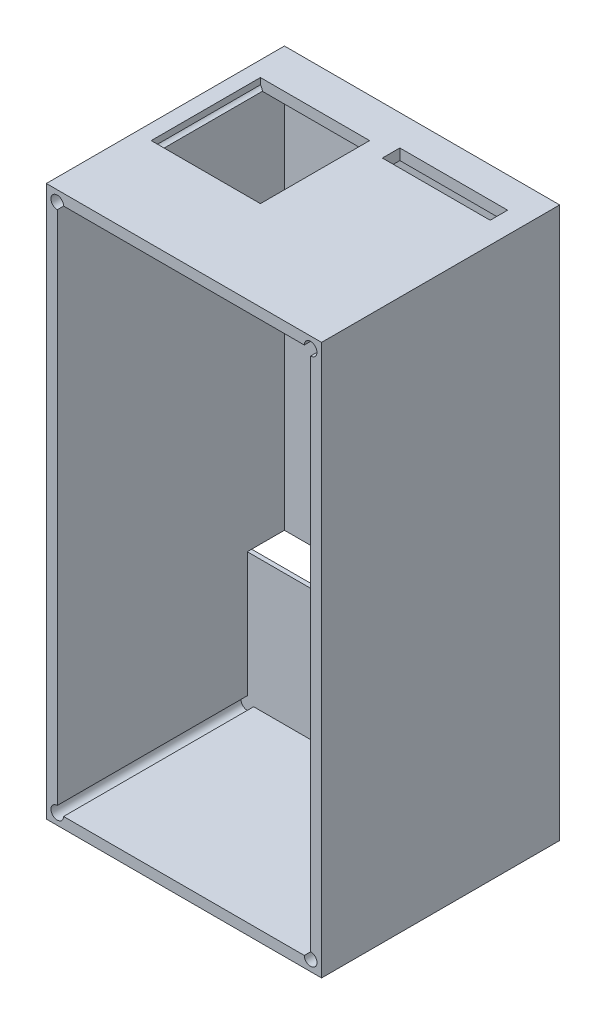
ISO-10303-21;
HEADER;
FILE_DESCRIPTION(('STEP AP214'),'2;1');
FILE_NAME('part.step','',(''),(''),'','','');
FILE_SCHEMA(('AUTOMOTIVE_DESIGN { 1 0 10303 214 1 1 1 1 }'));
ENDSEC;
DATA;
#1=APPLICATION_CONTEXT('core data for automotive mechanical design processes');
#2=APPLICATION_PROTOCOL_DEFINITION('international standard','automotive_design',2000,#1);
#3=PRODUCT_CONTEXT('',#1,'mechanical');
#4=PRODUCT('Part','Part','',(#3));
#5=PRODUCT_RELATED_PRODUCT_CATEGORY('part','',(#4));
#6=PRODUCT_DEFINITION_FORMATION('','',#4);
#7=PRODUCT_DEFINITION_CONTEXT('part definition',#1,'design');
#8=PRODUCT_DEFINITION('design','',#6,#7);
#9=PRODUCT_DEFINITION_SHAPE('','',#8);
#10=(LENGTH_UNIT() NAMED_UNIT(*) SI_UNIT(.MILLI.,.METRE.));
#11=(NAMED_UNIT(*) PLANE_ANGLE_UNIT() SI_UNIT($,.RADIAN.));
#12=(NAMED_UNIT(*) SI_UNIT($,.STERADIAN.) SOLID_ANGLE_UNIT());
#13=UNCERTAINTY_MEASURE_WITH_UNIT(LENGTH_MEASURE(1.E-05),#10,'distance_accuracy_value','');
#14=(GEOMETRIC_REPRESENTATION_CONTEXT(3) GLOBAL_UNCERTAINTY_ASSIGNED_CONTEXT((#13)) GLOBAL_UNIT_ASSIGNED_CONTEXT((#10,
#11,#12)) REPRESENTATION_CONTEXT('',''));
#15=CARTESIAN_POINT('',(0.,0.,0.));
#16=DIRECTION('',(0.,0.,1.));
#17=DIRECTION('',(1.,0.,0.));
#18=AXIS2_PLACEMENT_3D('',#15,#16,#17);
#19=CARTESIAN_POINT('',(0.,63.,52.));
#20=DIRECTION('',(0.,-1.,0.));
#21=DIRECTION('',(0.,0.,-1.));
#22=AXIS2_PLACEMENT_3D('',#19,#20,#21);
#23=PLANE('',#22);
#24=DIRECTION('',(0.,0.,-1.));
#25=VECTOR('',#24,1.);
#26=CARTESIAN_POINT('',(26.5858037953841,63.,0.));
#27=LINE('',#26,#25);
#28=CARTESIAN_POINT('',(26.5858037953841,63.,8.5));
#29=VERTEX_POINT('',#28);
#30=CARTESIAN_POINT('',(26.5858037953841,63.,4.5));
#31=VERTEX_POINT('',#30);
#32=EDGE_CURVE('E263',#29,#31,#27,.T.);
#33=ORIENTED_EDGE('',*,*,#32,.F.);
#34=DIRECTION('',(1.,0.,0.));
#35=VECTOR('',#34,1.);
#36=CARTESIAN_POINT('',(0.,63.,8.5));
#37=LINE('',#36,#35);
#38=CARTESIAN_POINT('',(1.91419620461589,63.,8.5));
#39=VERTEX_POINT('',#38);
#40=EDGE_CURVE('E57',#39,#29,#37,.T.);
#41=ORIENTED_EDGE('',*,*,#40,.F.);
#42=DIRECTION('',(0.,0.,-1.));
#43=VECTOR('',#42,1.);
#44=CARTESIAN_POINT('',(1.91419620461589,63.,0.));
#45=LINE('',#44,#43);
#46=CARTESIAN_POINT('',(1.91419620461589,63.,4.5));
#47=VERTEX_POINT('',#46);
#48=EDGE_CURVE('E270',#39,#47,#45,.T.);
#49=ORIENTED_EDGE('',*,*,#48,.T.);
#50=DIRECTION('',(1.,0.,0.));
#51=VECTOR('',#50,1.);
#52=CARTESIAN_POINT('',(0.,63.,4.5));
#53=LINE('',#52,#51);
#54=EDGE_CURVE('E253',#47,#31,#53,.T.);
#55=ORIENTED_EDGE('',*,*,#54,.T.);
#56=EDGE_LOOP('',(#33,#41,#49,#55));
#57=FACE_BOUND('',#56,.T.);
#58=DIRECTION('',(0.,0.,-1.));
#59=VECTOR('',#58,1.);
#60=CARTESIAN_POINT('',(31.5,63.,52.));
#61=LINE('',#60,#59);
#62=CARTESIAN_POINT('',(31.5,63.,52.));
#63=VERTEX_POINT('',#62);
#64=CARTESIAN_POINT('',(31.5,63.,-2.5));
#65=VERTEX_POINT('',#64);
#66=EDGE_CURVE('E534',#63,#65,#61,.T.);
#67=ORIENTED_EDGE('',*,*,#66,.T.);
#68=DIRECTION('',(1.,0.,0.));
#69=VECTOR('',#68,1.);
#70=CARTESIAN_POINT('',(31.5,63.,-2.5));
#71=LINE('',#70,#69);
#72=CARTESIAN_POINT('',(-31.5,63.,-2.5));
#73=VERTEX_POINT('',#72);
#74=EDGE_CURVE('E447',#73,#65,#71,.T.);
#75=ORIENTED_EDGE('',*,*,#74,.F.);
#76=DIRECTION('',(0.,0.,-1.));
#77=VECTOR('',#76,1.);
#78=CARTESIAN_POINT('',(-31.5,63.,52.));
#79=LINE('',#78,#77);
#80=CARTESIAN_POINT('',(-31.5,63.,52.));
#81=VERTEX_POINT('',#80);
#82=EDGE_CURVE('E530',#81,#73,#79,.T.);
#83=ORIENTED_EDGE('',*,*,#82,.F.);
#84=DIRECTION('',(-1.,0.,0.));
#85=VECTOR('',#84,1.);
#86=CARTESIAN_POINT('',(0.,63.,52.));
#87=LINE('',#86,#85);
#88=EDGE_CURVE('E487',#63,#81,#87,.T.);
#89=ORIENTED_EDGE('',*,*,#88,.F.);
#90=EDGE_LOOP('',(#67,#75,#83,#89));
#91=FACE_BOUND('',#90,.T.);
#92=DIRECTION('',(0.,0.,1.));
#93=VECTOR('',#92,1.);
#94=CARTESIAN_POINT('',(-3.00000000000001,63.,0.));
#95=LINE('',#94,#93);
#96=CARTESIAN_POINT('',(-3.00000000000001,63.,6.5));
#97=VERTEX_POINT('',#96);
#98=CARTESIAN_POINT('',(-3.,63.,31.5));
#99=VERTEX_POINT('',#98);
#100=EDGE_CURVE('E280',#97,#99,#95,.T.);
#101=ORIENTED_EDGE('',*,*,#100,.T.);
#102=DIRECTION('',(1.,0.,0.));
#103=VECTOR('',#102,1.);
#104=CARTESIAN_POINT('',(0.,63.,31.5));
#105=LINE('',#104,#103);
#106=CARTESIAN_POINT('',(-28.,63.,31.5));
#107=VERTEX_POINT('',#106);
#108=EDGE_CURVE('E296',#107,#99,#105,.T.);
#109=ORIENTED_EDGE('',*,*,#108,.F.);
#110=DIRECTION('',(0.,0.,1.));
#111=VECTOR('',#110,1.);
#112=CARTESIAN_POINT('',(-28.,63.,0.));
#113=LINE('',#112,#111);
#114=CARTESIAN_POINT('',(-28.,63.,6.5));
#115=VERTEX_POINT('',#114);
#116=EDGE_CURVE('E292',#115,#107,#113,.T.);
#117=ORIENTED_EDGE('',*,*,#116,.F.);
#118=DIRECTION('',(1.,0.,0.));
#119=VECTOR('',#118,1.);
#120=CARTESIAN_POINT('',(0.,63.,6.5));
#121=LINE('',#120,#119);
#122=EDGE_CURVE('E288',#115,#97,#121,.T.);
#123=ORIENTED_EDGE('',*,*,#122,.T.);
#124=EDGE_LOOP('',(#101,#109,#117,#123));
#125=FACE_BOUND('',#124,.T.);
#126=ADVANCED_FACE('F41',(#57,#91,#125),#23,.F.);
#127=CARTESIAN_POINT('',(0.,0.,7.5));
#128=DIRECTION('',(0.,0.,-1.));
#129=DIRECTION('',(-1.,0.,0.));
#130=AXIS2_PLACEMENT_3D('',#127,#128,#129);
#131=PLANE('',#130);
#132=DIRECTION('',(1.,0.,0.));
#133=VECTOR('',#132,1.);
#134=CARTESIAN_POINT('',(-31.5,-30.5,7.5));
#135=LINE('',#134,#133);
#136=CARTESIAN_POINT('',(-29.,-30.5,7.5));
#137=VERTEX_POINT('',#136);
#138=CARTESIAN_POINT('',(-10.,-30.5,7.5));
#139=VERTEX_POINT('',#138);
#140=EDGE_CURVE('E379',#137,#139,#135,.T.);
#141=ORIENTED_EDGE('',*,*,#140,.T.);
#142=DIRECTION('',(0.,1.,0.));
#143=VECTOR('',#142,1.);
#144=CARTESIAN_POINT('',(-10.,-63.,7.5));
#145=LINE('',#144,#143);
#146=CARTESIAN_POINT('',(-10.,-63.,7.5));
#147=VERTEX_POINT('',#146);
#148=EDGE_CURVE('E371',#147,#139,#145,.T.);
#149=ORIENTED_EDGE('',*,*,#148,.F.);
#150=DIRECTION('',(-1.,0.,0.));
#151=VECTOR('',#150,1.);
#152=CARTESIAN_POINT('',(-31.5,-63.,7.5));
#153=LINE('',#152,#151);
#154=CARTESIAN_POINT('',(-31.5,-63.,7.5));
#155=VERTEX_POINT('',#154);
#156=EDGE_CURVE('E414',#147,#155,#153,.T.);
#157=ORIENTED_EDGE('',*,*,#156,.T.);
#158=DIRECTION('',(0.,1.,0.));
#159=VECTOR('',#158,1.);
#160=CARTESIAN_POINT('',(-31.5,-63.,7.5));
#161=LINE('',#160,#159);
#162=CARTESIAN_POINT('',(-31.5,-30.5,7.5));
#163=VERTEX_POINT('',#162);
#164=EDGE_CURVE('E407',#155,#163,#161,.T.);
#165=ORIENTED_EDGE('',*,*,#164,.T.);
#166=DIRECTION('',(1.,0.,0.));
#167=VECTOR('',#166,1.);
#168=CARTESIAN_POINT('',(-31.5,-30.5,7.5));
#169=LINE('',#168,#167);
#170=EDGE_CURVE('E411',#163,#137,#169,.T.);
#171=ORIENTED_EDGE('',*,*,#170,.T.);
#172=EDGE_LOOP('',(#141,#149,#157,#165,#171));
#173=FACE_BOUND('',#172,.T.);
#174=ADVANCED_FACE('F614',(#173),#131,.T.);
#175=CARTESIAN_POINT('',(-31.5,-30.5,7.5));
#176=DIRECTION('',(0.,1.,0.));
#177=DIRECTION('',(-1.,0.,0.));
#178=AXIS2_PLACEMENT_3D('',#175,#176,#177);
#179=PLANE('',#178);
#180=DIRECTION('',(0.,0.,-1.));
#181=VECTOR('',#180,1.);
#182=CARTESIAN_POINT('',(-10.,-30.5,7.5));
#183=LINE('',#182,#181);
#184=CARTESIAN_POINT('',(-10.,-30.5,0.));
#185=VERTEX_POINT('',#184);
#186=CARTESIAN_POINT('',(-10.,-30.5,-2.5));
#187=VERTEX_POINT('',#186);
#188=EDGE_CURVE('E537',#185,#187,#183,.T.);
#189=ORIENTED_EDGE('',*,*,#188,.F.);
#190=DIRECTION('',(1.,0.,0.));
#191=VECTOR('',#190,1.);
#192=CARTESIAN_POINT('',(0.,-30.5,0.));
#193=LINE('',#192,#191);
#194=CARTESIAN_POINT('',(-29.,-30.5,0.));
#195=VERTEX_POINT('',#194);
#196=EDGE_CURVE('E423',#195,#185,#193,.T.);
#197=ORIENTED_EDGE('',*,*,#196,.F.);
#198=DIRECTION('',(0.,0.,1.));
#199=VECTOR('',#198,1.);
#200=CARTESIAN_POINT('',(-29.,-30.5,52.));
#201=LINE('',#200,#199);
#202=EDGE_CURVE('E427',#195,#137,#201,.T.);
#203=ORIENTED_EDGE('',*,*,#202,.T.);
#204=ORIENTED_EDGE('',*,*,#170,.F.);
#205=DIRECTION('',(0.,0.,-1.));
#206=VECTOR('',#205,1.);
#207=CARTESIAN_POINT('',(-31.5,-30.5,7.5));
#208=LINE('',#207,#206);
#209=CARTESIAN_POINT('',(-31.5,-30.5,-2.5));
#210=VERTEX_POINT('',#209);
#211=EDGE_CURVE('E417',#163,#210,#208,.T.);
#212=ORIENTED_EDGE('',*,*,#211,.T.);
#213=DIRECTION('',(1.,0.,0.));
#214=VECTOR('',#213,1.);
#215=CARTESIAN_POINT('',(-31.5,-30.5,-2.5));
#216=LINE('',#215,#214);
#217=EDGE_CURVE('E406',#210,#187,#216,.T.);
#218=ORIENTED_EDGE('',*,*,#217,.T.);
#219=EDGE_LOOP('',(#189,#197,#203,#204,#212,#218));
#220=FACE_BOUND('',#219,.T.);
#221=ADVANCED_FACE('F619',(#220),#179,.F.);
#222=CARTESIAN_POINT('',(-29.,-60.5,52.));
#223=DIRECTION('',(0.,0.,-1.));
#224=DIRECTION('',(-1.,0.,0.));
#225=AXIS2_PLACEMENT_3D('',#222,#223,#224);
#226=CYLINDRICAL_SURFACE('',#225,1.45);
#227=DIRECTION('',(0.,0.,-1.));
#228=VECTOR('',#227,1.);
#229=CARTESIAN_POINT('',(-27.55,-60.5,52.));
#230=LINE('',#229,#228);
#231=CARTESIAN_POINT('',(-27.55,-60.5,52.));
#232=VERTEX_POINT('',#231);
#233=CARTESIAN_POINT('',(-27.55,-60.5,8.50000000000001));
#234=VERTEX_POINT('',#233);
#235=EDGE_CURVE('E562',#232,#234,#230,.T.);
#236=ORIENTED_EDGE('',*,*,#235,.T.);
#237=CARTESIAN_POINT('',(-29.,-60.5,8.5));
#238=DIRECTION('',(0.,0.,-1.));
#239=DIRECTION('',(-1.,0.,0.));
#240=AXIS2_PLACEMENT_3D('',#237,#238,#239);
#241=CIRCLE('',#240,1.45);
#242=CARTESIAN_POINT('',(-29.,-59.05,8.50000000000001));
#243=VERTEX_POINT('',#242);
#244=EDGE_CURVE('E399',#234,#243,#241,.T.);
#245=ORIENTED_EDGE('',*,*,#244,.T.);
#246=DIRECTION('',(0.,0.,-1.));
#247=VECTOR('',#246,1.);
#248=CARTESIAN_POINT('',(-29.,-59.05,52.));
#249=LINE('',#248,#247);
#250=CARTESIAN_POINT('',(-29.,-59.05,52.));
#251=VERTEX_POINT('',#250);
#252=EDGE_CURVE('E558',#251,#243,#249,.T.);
#253=ORIENTED_EDGE('',*,*,#252,.F.);
#254=CARTESIAN_POINT('',(-29.,-60.5,52.));
#255=DIRECTION('',(0.,0.,1.));
#256=DIRECTION('',(1.,0.,0.));
#257=AXIS2_PLACEMENT_3D('',#254,#255,#256);
#258=CIRCLE('',#257,1.45);
#259=EDGE_CURVE('E460',#251,#232,#258,.T.);
#260=ORIENTED_EDGE('',*,*,#259,.T.);
#261=EDGE_LOOP('',(#236,#245,#253,#260));
#262=FACE_BOUND('',#261,.T.);
#263=ADVANCED_FACE('F629',(#262),#226,.F.);
#264=CARTESIAN_POINT('',(31.5,0.,52.));
#265=DIRECTION('',(1.,0.,0.));
#266=DIRECTION('',(0.,0.,-1.));
#267=AXIS2_PLACEMENT_3D('',#264,#265,#266);
#268=PLANE('',#267);
#269=DIRECTION('',(0.,0.,-1.));
#270=VECTOR('',#269,1.);
#271=CARTESIAN_POINT('',(31.5,-63.,52.));
#272=LINE('',#271,#270);
#273=CARTESIAN_POINT('',(31.5,-63.,52.));
#274=VERTEX_POINT('',#273);
#275=CARTESIAN_POINT('',(31.5,-63.,-2.5));
#276=VERTEX_POINT('',#275);
#277=EDGE_CURVE('E522',#274,#276,#272,.T.);
#278=ORIENTED_EDGE('',*,*,#277,.T.);
#279=DIRECTION('',(0.,-1.,0.));
#280=VECTOR('',#279,1.);
#281=CARTESIAN_POINT('',(31.5,63.,-2.5));
#282=LINE('',#281,#280);
#283=EDGE_CURVE('E437',#65,#276,#282,.T.);
#284=ORIENTED_EDGE('',*,*,#283,.F.);
#285=ORIENTED_EDGE('',*,*,#66,.F.);
#286=DIRECTION('',(0.,-1.,0.));
#287=VECTOR('',#286,1.);
#288=CARTESIAN_POINT('',(31.5,0.,52.));
#289=LINE('',#288,#287);
#290=EDGE_CURVE('E483',#63,#274,#289,.T.);
#291=ORIENTED_EDGE('',*,*,#290,.T.);
#292=EDGE_LOOP('',(#278,#284,#285,#291));
#293=FACE_BOUND('',#292,.T.);
#294=ADVANCED_FACE('F626',(#293),#268,.T.);
#295=CARTESIAN_POINT('',(-31.5,0.,52.));
#296=DIRECTION('',(1.,0.,0.));
#297=DIRECTION('',(0.,0.,-1.));
#298=AXIS2_PLACEMENT_3D('',#295,#296,#297);
#299=PLANE('',#298);
#300=ORIENTED_EDGE('',*,*,#211,.F.);
#301=ORIENTED_EDGE('',*,*,#164,.F.);
#302=DIRECTION('',(0.,0.,-1.));
#303=VECTOR('',#302,1.);
#304=CARTESIAN_POINT('',(-31.5,-63.,52.));
#305=LINE('',#304,#303);
#306=CARTESIAN_POINT('',(-31.5,-63.,52.));
#307=VERTEX_POINT('',#306);
#308=EDGE_CURVE('E525',#307,#155,#305,.T.);
#309=ORIENTED_EDGE('',*,*,#308,.F.);
#310=DIRECTION('',(0.,-1.,0.));
#311=VECTOR('',#310,1.);
#312=CARTESIAN_POINT('',(-31.5,0.,52.));
#313=LINE('',#312,#311);
#314=EDGE_CURVE('E491',#81,#307,#313,.T.);
#315=ORIENTED_EDGE('',*,*,#314,.F.);
#316=ORIENTED_EDGE('',*,*,#82,.T.);
#317=DIRECTION('',(0.,1.,0.));
#318=VECTOR('',#317,1.);
#319=CARTESIAN_POINT('',(-31.5,63.,-2.5));
#320=LINE('',#319,#318);
#321=EDGE_CURVE('E444',#210,#73,#320,.T.);
#322=ORIENTED_EDGE('',*,*,#321,.F.);
#323=EDGE_LOOP('',(#300,#301,#309,#315,#316,#322));
#324=FACE_BOUND('',#323,.T.);
#325=ADVANCED_FACE('F624',(#324),#299,.F.);
#326=CARTESIAN_POINT('',(29.,-60.5,52.));
#327=DIRECTION('',(0.,0.,-1.));
#328=DIRECTION('',(-1.,0.,0.));
#329=AXIS2_PLACEMENT_3D('',#326,#327,#328);
#330=CYLINDRICAL_SURFACE('',#329,1.45);
#331=CARTESIAN_POINT('',(29.,-60.5,0.));
#332=DIRECTION('',(0.,0.,1.));
#333=DIRECTION('',(1.,0.,0.));
#334=AXIS2_PLACEMENT_3D('',#331,#332,#333);
#335=CIRCLE('',#334,1.45);
#336=CARTESIAN_POINT('',(27.55,-60.5,0.));
#337=VERTEX_POINT('',#336);
#338=CARTESIAN_POINT('',(29.,-59.05,0.));
#339=VERTEX_POINT('',#338);
#340=EDGE_CURVE('E451',#337,#339,#335,.T.);
#341=ORIENTED_EDGE('',*,*,#340,.F.);
#342=DIRECTION('',(0.,0.,-1.));
#343=VECTOR('',#342,1.);
#344=CARTESIAN_POINT('',(27.55,-60.5,52.));
#345=LINE('',#344,#343);
#346=CARTESIAN_POINT('',(27.55,-60.5,52.));
#347=VERTEX_POINT('',#346);
#348=EDGE_CURVE('E526',#347,#337,#345,.T.);
#349=ORIENTED_EDGE('',*,*,#348,.F.);
#350=CARTESIAN_POINT('',(29.,-60.5,52.));
#351=DIRECTION('',(0.,0.,1.));
#352=DIRECTION('',(1.,0.,0.));
#353=AXIS2_PLACEMENT_3D('',#350,#351,#352);
#354=CIRCLE('',#353,1.45);
#355=CARTESIAN_POINT('',(29.,-59.05,52.));
#356=VERTEX_POINT('',#355);
#357=EDGE_CURVE('E452',#347,#356,#354,.T.);
#358=ORIENTED_EDGE('',*,*,#357,.T.);
#359=DIRECTION('',(0.,0.,-1.));
#360=VECTOR('',#359,1.);
#361=CARTESIAN_POINT('',(29.,-59.05,52.));
#362=LINE('',#361,#360);
#363=EDGE_CURVE('E498',#356,#339,#362,.T.);
#364=ORIENTED_EDGE('',*,*,#363,.T.);
#365=EDGE_LOOP('',(#341,#349,#358,#364));
#366=FACE_BOUND('',#365,.T.);
#367=ADVANCED_FACE('F43',(#366),#330,.F.);
#368=CARTESIAN_POINT('',(0.,-60.5,52.));
#369=DIRECTION('',(0.,-1.,0.));
#370=DIRECTION('',(1.,0.,0.));
#371=AXIS2_PLACEMENT_3D('',#368,#369,#370);
#372=PLANE('',#371);
#373=DIRECTION('',(0.,0.,1.));
#374=VECTOR('',#373,1.);
#375=CARTESIAN_POINT('',(-9.00000000000001,-60.5,52.));
#376=LINE('',#375,#374);
#377=CARTESIAN_POINT('',(-9.00000000000001,-60.5,0.));
#378=VERTEX_POINT('',#377);
#379=CARTESIAN_POINT('',(-9.00000000000001,-60.5,8.5));
#380=VERTEX_POINT('',#379);
#381=EDGE_CURVE('E434',#378,#380,#376,.T.);
#382=ORIENTED_EDGE('',*,*,#381,.T.);
#383=DIRECTION('',(1.,0.,0.));
#384=VECTOR('',#383,1.);
#385=CARTESIAN_POINT('',(0.,-60.5,8.5));
#386=LINE('',#385,#384);
#387=EDGE_CURVE('E402',#234,#380,#386,.T.);
#388=ORIENTED_EDGE('',*,*,#387,.F.);
#389=ORIENTED_EDGE('',*,*,#235,.F.);
#390=DIRECTION('',(-1.,0.,0.));
#391=VECTOR('',#390,1.);
#392=CARTESIAN_POINT('',(0.,-60.5,52.));
#393=LINE('',#392,#391);
#394=EDGE_CURVE('E456',#347,#232,#393,.T.);
#395=ORIENTED_EDGE('',*,*,#394,.F.);
#396=ORIENTED_EDGE('',*,*,#348,.T.);
#397=DIRECTION('',(-1.,0.,0.));
#398=VECTOR('',#397,1.);
#399=CARTESIAN_POINT('',(0.,-60.5,0.));
#400=LINE('',#399,#398);
#401=EDGE_CURVE('E501',#337,#378,#400,.T.);
#402=ORIENTED_EDGE('',*,*,#401,.T.);
#403=EDGE_LOOP('',(#382,#388,#389,#395,#396,#402));
#404=FACE_BOUND('',#403,.T.);
#405=ADVANCED_FACE('F649',(#404),#372,.F.);
#406=CARTESIAN_POINT('',(-29.,0.,52.));
#407=DIRECTION('',(1.,0.,0.));
#408=DIRECTION('',(0.,1.,0.));
#409=AXIS2_PLACEMENT_3D('',#406,#407,#408);
#410=PLANE('',#409);
#411=DIRECTION('',(0.,0.,1.));
#412=VECTOR('',#411,1.);
#413=CARTESIAN_POINT('',(-29.,-30.5,52.));
#414=LINE('',#413,#412);
#415=CARTESIAN_POINT('',(-29.,-30.5,8.5));
#416=VERTEX_POINT('',#415);
#417=EDGE_CURVE('E392',#137,#416,#414,.T.);
#418=ORIENTED_EDGE('',*,*,#417,.F.);
#419=ORIENTED_EDGE('',*,*,#202,.F.);
#420=DIRECTION('',(0.,-1.,0.));
#421=VECTOR('',#420,1.);
#422=CARTESIAN_POINT('',(-29.,0.,0.));
#423=LINE('',#422,#421);
#424=CARTESIAN_POINT('',(-29.,59.05,0.));
#425=VERTEX_POINT('',#424);
#426=EDGE_CURVE('E505',#425,#195,#423,.T.);
#427=ORIENTED_EDGE('',*,*,#426,.F.);
#428=DIRECTION('',(0.,0.,-1.));
#429=VECTOR('',#428,1.);
#430=CARTESIAN_POINT('',(-29.,59.05,52.));
#431=LINE('',#430,#429);
#432=CARTESIAN_POINT('',(-29.,59.05,52.));
#433=VERTEX_POINT('',#432);
#434=EDGE_CURVE('E554',#433,#425,#431,.T.);
#435=ORIENTED_EDGE('',*,*,#434,.F.);
#436=DIRECTION('',(0.,-1.,0.));
#437=VECTOR('',#436,1.);
#438=CARTESIAN_POINT('',(-29.,0.,52.));
#439=LINE('',#438,#437);
#440=EDGE_CURVE('E464',#433,#251,#439,.T.);
#441=ORIENTED_EDGE('',*,*,#440,.T.);
#442=ORIENTED_EDGE('',*,*,#252,.T.);
#443=DIRECTION('',(0.,1.,0.));
#444=VECTOR('',#443,1.);
#445=CARTESIAN_POINT('',(-29.,0.,8.5));
#446=LINE('',#445,#444);
#447=EDGE_CURVE('E396',#243,#416,#446,.T.);
#448=ORIENTED_EDGE('',*,*,#447,.T.);
#449=EDGE_LOOP('',(#418,#419,#427,#435,#441,#442,#448));
#450=FACE_BOUND('',#449,.T.);
#451=ADVANCED_FACE('F645',(#450),#410,.T.);
#452=CARTESIAN_POINT('',(-29.,60.5,52.));
#453=DIRECTION('',(0.,0.,-1.));
#454=DIRECTION('',(-1.,0.,0.));
#455=AXIS2_PLACEMENT_3D('',#452,#453,#454);
#456=CYLINDRICAL_SURFACE('',#455,1.45);
#457=CARTESIAN_POINT('',(-29.,60.5,31.5));
#458=DIRECTION('',(0.,0.,1.));
#459=DIRECTION('',(1.,0.,0.));
#460=AXIS2_PLACEMENT_3D('',#457,#458,#459);
#461=CIRCLE('',#460,1.45);
#462=CARTESIAN_POINT('',(-27.55,60.5,31.5));
#463=VERTEX_POINT('',#462);
#464=CARTESIAN_POINT('',(-28.,61.55,31.5));
#465=VERTEX_POINT('',#464);
#466=EDGE_CURVE('E317',#463,#465,#461,.T.);
#467=ORIENTED_EDGE('',*,*,#466,.F.);
#468=DIRECTION('',(0.,0.,-1.));
#469=VECTOR('',#468,1.);
#470=CARTESIAN_POINT('',(-27.55,60.5,52.));
#471=LINE('',#470,#469);
#472=CARTESIAN_POINT('',(-27.55,60.5,52.));
#473=VERTEX_POINT('',#472);
#474=EDGE_CURVE('E550',#473,#463,#471,.T.);
#475=ORIENTED_EDGE('',*,*,#474,.F.);
#476=CARTESIAN_POINT('',(-29.,60.5,52.));
#477=DIRECTION('',(0.,0.,1.));
#478=DIRECTION('',(1.,0.,0.));
#479=AXIS2_PLACEMENT_3D('',#476,#477,#478);
#480=CIRCLE('',#479,1.45);
#481=EDGE_CURVE('E468',#473,#433,#480,.T.);
#482=ORIENTED_EDGE('',*,*,#481,.T.);
#483=ORIENTED_EDGE('',*,*,#434,.T.);
#484=CARTESIAN_POINT('',(-29.,60.5,0.));
#485=DIRECTION('',(0.,0.,1.));
#486=DIRECTION('',(1.,0.,0.));
#487=AXIS2_PLACEMENT_3D('',#484,#485,#486);
#488=CIRCLE('',#487,1.45);
#489=CARTESIAN_POINT('',(-27.55,60.5,0.));
#490=VERTEX_POINT('',#489);
#491=EDGE_CURVE('E509',#490,#425,#488,.T.);
#492=ORIENTED_EDGE('',*,*,#491,.F.);
#493=CARTESIAN_POINT('',(-27.55,60.5,6.50000000000001));
#494=VERTEX_POINT('',#493);
#495=EDGE_CURVE('E549',#494,#490,#471,.T.);
#496=ORIENTED_EDGE('',*,*,#495,.F.);
#497=CARTESIAN_POINT('',(-29.,60.5,6.5));
#498=DIRECTION('',(0.,0.,1.));
#499=DIRECTION('',(1.,0.,0.));
#500=AXIS2_PLACEMENT_3D('',#497,#498,#499);
#501=CIRCLE('',#500,1.45);
#502=CARTESIAN_POINT('',(-28.,61.55,6.5));
#503=VERTEX_POINT('',#502);
#504=EDGE_CURVE('E304',#494,#503,#501,.T.);
#505=ORIENTED_EDGE('',*,*,#504,.T.);
#506=DIRECTION('',(0.,0.,-1.));
#507=VECTOR('',#506,1.);
#508=CARTESIAN_POINT('',(-28.,61.55,52.));
#509=LINE('',#508,#507);
#510=EDGE_CURVE('E583',#465,#503,#509,.T.);
#511=ORIENTED_EDGE('',*,*,#510,.F.);
#512=EDGE_LOOP('',(#467,#475,#482,#483,#492,#496,#505,#511));
#513=FACE_BOUND('',#512,.T.);
#514=ADVANCED_FACE('F642',(#513),#456,.F.);
#515=CARTESIAN_POINT('',(0.,60.5,52.));
#516=DIRECTION('',(0.,-1.,0.));
#517=DIRECTION('',(1.,0.,0.));
#518=AXIS2_PLACEMENT_3D('',#515,#516,#517);
#519=PLANE('',#518);
#520=DIRECTION('',(-1.,0.,0.));
#521=VECTOR('',#520,1.);
#522=CARTESIAN_POINT('',(0.,60.5,8.5));
#523=LINE('',#522,#521);
#524=CARTESIAN_POINT('',(26.5858037953841,60.5,8.5));
#525=VERTEX_POINT('',#524);
#526=CARTESIAN_POINT('',(1.91419620461589,60.5,8.5));
#527=VERTEX_POINT('',#526);
#528=EDGE_CURVE('E11',#525,#527,#523,.T.);
#529=ORIENTED_EDGE('',*,*,#528,.F.);
#530=DIRECTION('',(0.,0.,1.));
#531=VECTOR('',#530,1.);
#532=CARTESIAN_POINT('',(26.5858037953841,60.5,52.));
#533=LINE('',#532,#531);
#534=CARTESIAN_POINT('',(26.5858037953841,60.5,4.5));
#535=VERTEX_POINT('',#534);
#536=EDGE_CURVE('E586',#535,#525,#533,.T.);
#537=ORIENTED_EDGE('',*,*,#536,.F.);
#538=DIRECTION('',(-1.,0.,0.));
#539=VECTOR('',#538,1.);
#540=CARTESIAN_POINT('',(0.,60.5,4.5));
#541=LINE('',#540,#539);
#542=CARTESIAN_POINT('',(1.91419620461589,60.5,4.5));
#543=VERTEX_POINT('',#542);
#544=EDGE_CURVE('E256',#535,#543,#541,.T.);
#545=ORIENTED_EDGE('',*,*,#544,.T.);
#546=DIRECTION('',(0.,0.,1.));
#547=VECTOR('',#546,1.);
#548=CARTESIAN_POINT('',(1.91419620461589,60.5,52.));
#549=LINE('',#548,#547);
#550=EDGE_CURVE('E50',#543,#527,#549,.T.);
#551=ORIENTED_EDGE('',*,*,#550,.T.);
#552=EDGE_LOOP('',(#529,#537,#545,#551));
#553=FACE_BOUND('',#552,.T.);
#554=DIRECTION('',(-1.,0.,0.));
#555=VECTOR('',#554,1.);
#556=CARTESIAN_POINT('',(0.,60.5,31.5));
#557=LINE('',#556,#555);
#558=CARTESIAN_POINT('',(-3.,60.5,31.5));
#559=VERTEX_POINT('',#558);
#560=EDGE_CURVE('E580',#559,#463,#557,.T.);
#561=ORIENTED_EDGE('',*,*,#560,.F.);
#562=DIRECTION('',(0.,0.,-1.));
#563=VECTOR('',#562,1.);
#564=CARTESIAN_POINT('',(-3.,60.5,52.));
#565=LINE('',#564,#563);
#566=CARTESIAN_POINT('',(-3.00000000000001,60.5,6.5));
#567=VERTEX_POINT('',#566);
#568=EDGE_CURVE('E576',#559,#567,#565,.T.);
#569=ORIENTED_EDGE('',*,*,#568,.T.);
#570=DIRECTION('',(-1.,0.,0.));
#571=VECTOR('',#570,1.);
#572=CARTESIAN_POINT('',(0.,60.5,6.5));
#573=LINE('',#572,#571);
#574=EDGE_CURVE('E572',#567,#494,#573,.T.);
#575=ORIENTED_EDGE('',*,*,#574,.T.);
#576=ORIENTED_EDGE('',*,*,#495,.T.);
#577=DIRECTION('',(-1.,0.,0.));
#578=VECTOR('',#577,1.);
#579=CARTESIAN_POINT('',(0.,60.5,0.));
#580=LINE('',#579,#578);
#581=CARTESIAN_POINT('',(27.55,60.5,0.));
#582=VERTEX_POINT('',#581);
#583=EDGE_CURVE('E512',#582,#490,#580,.T.);
#584=ORIENTED_EDGE('',*,*,#583,.F.);
#585=DIRECTION('',(0.,0.,-1.));
#586=VECTOR('',#585,1.);
#587=CARTESIAN_POINT('',(27.55,60.5,52.));
#588=LINE('',#587,#586);
#589=CARTESIAN_POINT('',(27.55,60.5,52.));
#590=VERTEX_POINT('',#589);
#591=EDGE_CURVE('E545',#590,#582,#588,.T.);
#592=ORIENTED_EDGE('',*,*,#591,.F.);
#593=DIRECTION('',(-1.,0.,0.));
#594=VECTOR('',#593,1.);
#595=CARTESIAN_POINT('',(0.,60.5,52.));
#596=LINE('',#595,#594);
#597=EDGE_CURVE('E472',#590,#473,#596,.T.);
#598=ORIENTED_EDGE('',*,*,#597,.T.);
#599=ORIENTED_EDGE('',*,*,#474,.T.);
#600=EDGE_LOOP('',(#561,#569,#575,#576,#584,#592,#598,#599));
#601=FACE_BOUND('',#600,.T.);
#602=ADVANCED_FACE('F594',(#553,#601),#519,.T.);
#603=CARTESIAN_POINT('',(29.,60.5,52.));
#604=DIRECTION('',(0.,0.,-1.));
#605=DIRECTION('',(-1.,0.,0.));
#606=AXIS2_PLACEMENT_3D('',#603,#604,#605);
#607=CYLINDRICAL_SURFACE('',#606,1.45);
#608=CARTESIAN_POINT('',(29.,60.5,0.));
#609=DIRECTION('',(0.,0.,1.));
#610=DIRECTION('',(1.,0.,0.));
#611=AXIS2_PLACEMENT_3D('',#608,#609,#610);
#612=CIRCLE('',#611,1.45);
#613=CARTESIAN_POINT('',(29.,59.05,0.));
#614=VERTEX_POINT('',#613);
#615=EDGE_CURVE('E516',#614,#582,#612,.T.);
#616=ORIENTED_EDGE('',*,*,#615,.F.);
#617=DIRECTION('',(0.,0.,-1.));
#618=VECTOR('',#617,1.);
#619=CARTESIAN_POINT('',(29.,59.05,52.));
#620=LINE('',#619,#618);
#621=CARTESIAN_POINT('',(29.,59.05,52.));
#622=VERTEX_POINT('',#621);
#623=EDGE_CURVE('E541',#622,#614,#620,.T.);
#624=ORIENTED_EDGE('',*,*,#623,.F.);
#625=CARTESIAN_POINT('',(29.,60.5,52.));
#626=DIRECTION('',(0.,0.,1.));
#627=DIRECTION('',(1.,0.,0.));
#628=AXIS2_PLACEMENT_3D('',#625,#626,#627);
#629=CIRCLE('',#628,1.45);
#630=EDGE_CURVE('E476',#622,#590,#629,.T.);
#631=ORIENTED_EDGE('',*,*,#630,.T.);
#632=ORIENTED_EDGE('',*,*,#591,.T.);
#633=EDGE_LOOP('',(#616,#624,#631,#632));
#634=FACE_BOUND('',#633,.T.);
#635=ADVANCED_FACE('F635',(#634),#607,.F.);
#636=CARTESIAN_POINT('',(29.,0.,52.));
#637=DIRECTION('',(1.,0.,0.));
#638=DIRECTION('',(0.,1.,0.));
#639=AXIS2_PLACEMENT_3D('',#636,#637,#638);
#640=PLANE('',#639);
#641=DIRECTION('',(0.,-1.,0.));
#642=VECTOR('',#641,1.);
#643=CARTESIAN_POINT('',(29.,0.,0.));
#644=LINE('',#643,#642);
#645=EDGE_CURVE('E457',#614,#339,#644,.T.);
#646=ORIENTED_EDGE('',*,*,#645,.T.);
#647=ORIENTED_EDGE('',*,*,#363,.F.);
#648=DIRECTION('',(0.,-1.,0.));
#649=VECTOR('',#648,1.);
#650=CARTESIAN_POINT('',(29.,0.,52.));
#651=LINE('',#650,#649);
#652=EDGE_CURVE('E480',#622,#356,#651,.T.);
#653=ORIENTED_EDGE('',*,*,#652,.F.);
#654=ORIENTED_EDGE('',*,*,#623,.T.);
#655=EDGE_LOOP('',(#646,#647,#653,#654));
#656=FACE_BOUND('',#655,.T.);
#657=ADVANCED_FACE('F631',(#656),#640,.F.);
#658=CARTESIAN_POINT('',(0.,-63.,52.));
#659=DIRECTION('',(0.,-1.,0.));
#660=DIRECTION('',(1.,0.,0.));
#661=AXIS2_PLACEMENT_3D('',#658,#659,#660);
#662=PLANE('',#661);
#663=ORIENTED_EDGE('',*,*,#156,.F.);
#664=DIRECTION('',(0.,0.,1.));
#665=VECTOR('',#664,1.);
#666=CARTESIAN_POINT('',(-10.,-63.,-2.5));
#667=LINE('',#666,#665);
#668=CARTESIAN_POINT('',(-10.,-63.,-2.5));
#669=VERTEX_POINT('',#668);
#670=EDGE_CURVE('E367',#669,#147,#667,.T.);
#671=ORIENTED_EDGE('',*,*,#670,.F.);
#672=DIRECTION('',(-1.,0.,0.));
#673=VECTOR('',#672,1.);
#674=CARTESIAN_POINT('',(31.5,-63.,-2.5));
#675=LINE('',#674,#673);
#676=EDGE_CURVE('E441',#276,#669,#675,.T.);
#677=ORIENTED_EDGE('',*,*,#676,.F.);
#678=ORIENTED_EDGE('',*,*,#277,.F.);
#679=DIRECTION('',(-1.,0.,0.));
#680=VECTOR('',#679,1.);
#681=CARTESIAN_POINT('',(0.,-63.,52.));
#682=LINE('',#681,#680);
#683=EDGE_CURVE('E494',#274,#307,#682,.T.);
#684=ORIENTED_EDGE('',*,*,#683,.T.);
#685=ORIENTED_EDGE('',*,*,#308,.T.);
#686=EDGE_LOOP('',(#663,#671,#677,#678,#684,#685));
#687=FACE_BOUND('',#686,.T.);
#688=ADVANCED_FACE('F634',(#687),#662,.T.);
#689=CARTESIAN_POINT('',(0.,0.,52.));
#690=DIRECTION('',(0.,0.,1.));
#691=DIRECTION('',(1.,0.,0.));
#692=AXIS2_PLACEMENT_3D('',#689,#690,#691);
#693=PLANE('',#692);
#694=ORIENTED_EDGE('',*,*,#357,.F.);
#695=ORIENTED_EDGE('',*,*,#394,.T.);
#696=ORIENTED_EDGE('',*,*,#259,.F.);
#697=ORIENTED_EDGE('',*,*,#440,.F.);
#698=ORIENTED_EDGE('',*,*,#481,.F.);
#699=ORIENTED_EDGE('',*,*,#597,.F.);
#700=ORIENTED_EDGE('',*,*,#630,.F.);
#701=ORIENTED_EDGE('',*,*,#652,.T.);
#702=EDGE_LOOP('',(#694,#695,#696,#697,#698,#699,#700,#701));
#703=FACE_BOUND('',#702,.T.);
#704=ORIENTED_EDGE('',*,*,#290,.F.);
#705=ORIENTED_EDGE('',*,*,#88,.T.);
#706=ORIENTED_EDGE('',*,*,#314,.T.);
#707=ORIENTED_EDGE('',*,*,#683,.F.);
#708=EDGE_LOOP('',(#704,#705,#706,#707));
#709=FACE_BOUND('',#708,.T.);
#710=ADVANCED_FACE('F715',(#703,#709),#693,.T.);
#711=CARTESIAN_POINT('',(0.,0.,0.));
#712=DIRECTION('',(0.,0.,-1.));
#713=DIRECTION('',(-1.,0.,0.));
#714=AXIS2_PLACEMENT_3D('',#711,#712,#713);
#715=PLANE('',#714);
#716=DIRECTION('',(0.,-1.,0.));
#717=VECTOR('',#716,1.);
#718=CARTESIAN_POINT('',(-22.,0.,0.));
#719=LINE('',#718,#717);
#720=CARTESIAN_POINT('',(-22.,39.2,0.));
#721=VERTEX_POINT('',#720);
#722=CARTESIAN_POINT('',(-22.,20.8,0.));
#723=VERTEX_POINT('',#722);
#724=EDGE_CURVE('E356',#721,#723,#719,.T.);
#725=ORIENTED_EDGE('',*,*,#724,.F.);
#726=DIRECTION('',(1.,0.,0.));
#727=VECTOR('',#726,1.);
#728=CARTESIAN_POINT('',(0.,39.2,0.));
#729=LINE('',#728,#727);
#730=CARTESIAN_POINT('',(-10.4,39.2,0.));
#731=VERTEX_POINT('',#730);
#732=EDGE_CURVE('E359',#721,#731,#729,.T.);
#733=ORIENTED_EDGE('',*,*,#732,.T.);
#734=DIRECTION('',(0.,-1.,0.));
#735=VECTOR('',#734,1.);
#736=CARTESIAN_POINT('',(-10.4,0.,0.));
#737=LINE('',#736,#735);
#738=CARTESIAN_POINT('',(-10.4,20.8,0.));
#739=VERTEX_POINT('',#738);
#740=EDGE_CURVE('E339',#731,#739,#737,.T.);
#741=ORIENTED_EDGE('',*,*,#740,.T.);
#742=DIRECTION('',(1.,0.,0.));
#743=VECTOR('',#742,1.);
#744=CARTESIAN_POINT('',(0.,20.8,0.));
#745=LINE('',#744,#743);
#746=EDGE_CURVE('E352',#723,#739,#745,.T.);
#747=ORIENTED_EDGE('',*,*,#746,.F.);
#748=EDGE_LOOP('',(#725,#733,#741,#747));
#749=FACE_BOUND('',#748,.T.);
#750=ORIENTED_EDGE('',*,*,#196,.T.);
#751=CARTESIAN_POINT('',(-9.00000000000001,-30.5,0.));
#752=VERTEX_POINT('',#751);
#753=EDGE_CURVE('E422',#185,#752,#193,.T.);
#754=ORIENTED_EDGE('',*,*,#753,.T.);
#755=DIRECTION('',(0.,-1.,0.));
#756=VECTOR('',#755,1.);
#757=CARTESIAN_POINT('',(-9.00000000000001,0.,0.));
#758=LINE('',#757,#756);
#759=EDGE_CURVE('E431',#752,#378,#758,.T.);
#760=ORIENTED_EDGE('',*,*,#759,.T.);
#761=ORIENTED_EDGE('',*,*,#401,.F.);
#762=ORIENTED_EDGE('',*,*,#340,.T.);
#763=ORIENTED_EDGE('',*,*,#645,.F.);
#764=ORIENTED_EDGE('',*,*,#615,.T.);
#765=ORIENTED_EDGE('',*,*,#583,.T.);
#766=ORIENTED_EDGE('',*,*,#491,.T.);
#767=ORIENTED_EDGE('',*,*,#426,.T.);
#768=EDGE_LOOP('',(#750,#754,#760,#761,#762,#763,#764,#765,#766,#767));
#769=FACE_BOUND('',#768,.T.);
#770=ADVANCED_FACE('F678',(#749,#769),#715,.F.);
#771=CARTESIAN_POINT('',(0.,0.,-2.5));
#772=DIRECTION('',(0.,0.,-1.));
#773=DIRECTION('',(-1.,0.,0.));
#774=AXIS2_PLACEMENT_3D('',#771,#772,#773);
#775=PLANE('',#774);
#776=DIRECTION('',(1.,0.,0.));
#777=VECTOR('',#776,1.);
#778=CARTESIAN_POINT('',(0.,39.2,-2.5));
#779=LINE('',#778,#777);
#780=CARTESIAN_POINT('',(-22.,39.2,-2.5));
#781=VERTEX_POINT('',#780);
#782=CARTESIAN_POINT('',(-10.4,39.2,-2.5));
#783=VERTEX_POINT('',#782);
#784=EDGE_CURVE('E320',#781,#783,#779,.T.);
#785=ORIENTED_EDGE('',*,*,#784,.F.);
#786=DIRECTION('',(0.,-1.,0.));
#787=VECTOR('',#786,1.);
#788=CARTESIAN_POINT('',(-22.,0.,-2.5));
#789=LINE('',#788,#787);
#790=CARTESIAN_POINT('',(-22.,20.8,-2.5));
#791=VERTEX_POINT('',#790);
#792=EDGE_CURVE('E331',#781,#791,#789,.T.);
#793=ORIENTED_EDGE('',*,*,#792,.T.);
#794=DIRECTION('',(1.,0.,0.));
#795=VECTOR('',#794,1.);
#796=CARTESIAN_POINT('',(0.,20.8,-2.5));
#797=LINE('',#796,#795);
#798=CARTESIAN_POINT('',(-10.4,20.8,-2.5));
#799=VERTEX_POINT('',#798);
#800=EDGE_CURVE('E327',#791,#799,#797,.T.);
#801=ORIENTED_EDGE('',*,*,#800,.T.);
#802=DIRECTION('',(0.,-1.,0.));
#803=VECTOR('',#802,1.);
#804=CARTESIAN_POINT('',(-10.4,0.,-2.5));
#805=LINE('',#804,#803);
#806=EDGE_CURVE('E323',#783,#799,#805,.T.);
#807=ORIENTED_EDGE('',*,*,#806,.F.);
#808=EDGE_LOOP('',(#785,#793,#801,#807));
#809=FACE_BOUND('',#808,.T.);
#810=ORIENTED_EDGE('',*,*,#676,.T.);
#811=DIRECTION('',(0.,-1.,0.));
#812=VECTOR('',#811,1.);
#813=CARTESIAN_POINT('',(-10.,-63.,-2.5));
#814=LINE('',#813,#812);
#815=EDGE_CURVE('E363',#187,#669,#814,.T.);
#816=ORIENTED_EDGE('',*,*,#815,.F.);
#817=ORIENTED_EDGE('',*,*,#217,.F.);
#818=ORIENTED_EDGE('',*,*,#321,.T.);
#819=ORIENTED_EDGE('',*,*,#74,.T.);
#820=ORIENTED_EDGE('',*,*,#283,.T.);
#821=EDGE_LOOP('',(#810,#816,#817,#818,#819,#820));
#822=FACE_BOUND('',#821,.T.);
#823=ADVANCED_FACE('F698',(#809,#822),#775,.T.);
#824=CARTESIAN_POINT('',(0.,0.,8.5));
#825=DIRECTION('',(0.,0.,-1.));
#826=DIRECTION('',(-1.,0.,0.));
#827=AXIS2_PLACEMENT_3D('',#824,#825,#826);
#828=PLANE('',#827);
#829=ORIENTED_EDGE('',*,*,#244,.F.);
#830=ORIENTED_EDGE('',*,*,#387,.T.);
#831=DIRECTION('',(0.,-1.,0.));
#832=VECTOR('',#831,1.);
#833=CARTESIAN_POINT('',(-9.00000000000001,-63.,8.5));
#834=LINE('',#833,#832);
#835=CARTESIAN_POINT('',(-9.00000000000001,-30.5,8.5));
#836=VERTEX_POINT('',#835);
#837=EDGE_CURVE('E383',#836,#380,#834,.T.);
#838=ORIENTED_EDGE('',*,*,#837,.F.);
#839=DIRECTION('',(1.,0.,0.));
#840=VECTOR('',#839,1.);
#841=CARTESIAN_POINT('',(-31.5,-30.5,8.5));
#842=LINE('',#841,#840);
#843=EDGE_CURVE('E380',#416,#836,#842,.T.);
#844=ORIENTED_EDGE('',*,*,#843,.F.);
#845=ORIENTED_EDGE('',*,*,#447,.F.);
#846=EDGE_LOOP('',(#829,#830,#838,#844,#845));
#847=FACE_BOUND('',#846,.T.);
#848=ADVANCED_FACE('F666',(#847),#828,.F.);
#849=CARTESIAN_POINT('',(-9.00000000000001,-63.,8.5));
#850=DIRECTION('',(1.,0.,0.));
#851=DIRECTION('',(0.,0.,-1.));
#852=AXIS2_PLACEMENT_3D('',#849,#850,#851);
#853=PLANE('',#852);
#854=ORIENTED_EDGE('',*,*,#837,.T.);
#855=ORIENTED_EDGE('',*,*,#381,.F.);
#856=ORIENTED_EDGE('',*,*,#759,.F.);
#857=DIRECTION('',(0.,0.,-1.));
#858=VECTOR('',#857,1.);
#859=CARTESIAN_POINT('',(-9.00000000000001,-30.5,8.5));
#860=LINE('',#859,#858);
#861=EDGE_CURVE('E387',#836,#752,#860,.T.);
#862=ORIENTED_EDGE('',*,*,#861,.F.);
#863=EDGE_LOOP('',(#854,#855,#856,#862));
#864=FACE_BOUND('',#863,.T.);
#865=ADVANCED_FACE('F670',(#864),#853,.T.);
#866=CARTESIAN_POINT('',(-31.5,-30.5,8.5));
#867=DIRECTION('',(0.,1.,0.));
#868=DIRECTION('',(0.,0.,1.));
#869=AXIS2_PLACEMENT_3D('',#866,#867,#868);
#870=PLANE('',#869);
#871=ORIENTED_EDGE('',*,*,#140,.F.);
#872=ORIENTED_EDGE('',*,*,#417,.T.);
#873=ORIENTED_EDGE('',*,*,#843,.T.);
#874=ORIENTED_EDGE('',*,*,#861,.T.);
#875=ORIENTED_EDGE('',*,*,#753,.F.);
#876=DIRECTION('',(0.,0.,-1.));
#877=VECTOR('',#876,1.);
#878=CARTESIAN_POINT('',(-10.,-30.5,-2.5));
#879=LINE('',#878,#877);
#880=EDGE_CURVE('E375',#139,#185,#879,.T.);
#881=ORIENTED_EDGE('',*,*,#880,.F.);
#882=EDGE_LOOP('',(#871,#872,#873,#874,#875,#881));
#883=FACE_BOUND('',#882,.T.);
#884=ADVANCED_FACE('F675',(#883),#870,.T.);
#885=CARTESIAN_POINT('',(-10.,0.,0.));
#886=DIRECTION('',(1.,0.,0.));
#887=DIRECTION('',(0.,0.,-1.));
#888=AXIS2_PLACEMENT_3D('',#885,#886,#887);
#889=PLANE('',#888);
#890=ORIENTED_EDGE('',*,*,#815,.T.);
#891=ORIENTED_EDGE('',*,*,#670,.T.);
#892=ORIENTED_EDGE('',*,*,#148,.T.);
#893=ORIENTED_EDGE('',*,*,#880,.T.);
#894=ORIENTED_EDGE('',*,*,#188,.T.);
#895=EDGE_LOOP('',(#890,#891,#892,#893,#894));
#896=FACE_BOUND('',#895,.T.);
#897=ADVANCED_FACE('F696',(#896),#889,.F.);
#898=CARTESIAN_POINT('',(0.,39.2,52.));
#899=DIRECTION('',(0.,1.,0.));
#900=DIRECTION('',(0.,0.,1.));
#901=AXIS2_PLACEMENT_3D('',#898,#899,#900);
#902=PLANE('',#901);
#903=DIRECTION('',(0.,0.,-1.));
#904=VECTOR('',#903,1.);
#905=CARTESIAN_POINT('',(-22.,39.2,52.));
#906=LINE('',#905,#904);
#907=EDGE_CURVE('E336',#721,#781,#906,.T.);
#908=ORIENTED_EDGE('',*,*,#907,.T.);
#909=ORIENTED_EDGE('',*,*,#784,.T.);
#910=DIRECTION('',(0.,0.,-1.));
#911=VECTOR('',#910,1.);
#912=CARTESIAN_POINT('',(-10.4,39.2,52.));
#913=LINE('',#912,#911);
#914=EDGE_CURVE('E335',#731,#783,#913,.T.);
#915=ORIENTED_EDGE('',*,*,#914,.F.);
#916=ORIENTED_EDGE('',*,*,#732,.F.);
#917=EDGE_LOOP('',(#908,#909,#915,#916));
#918=FACE_BOUND('',#917,.T.);
#919=ADVANCED_FACE('F761',(#918),#902,.F.);
#920=CARTESIAN_POINT('',(-22.,0.,52.));
#921=DIRECTION('',(1.,0.,0.));
#922=DIRECTION('',(0.,0.,-1.));
#923=AXIS2_PLACEMENT_3D('',#920,#921,#922);
#924=PLANE('',#923);
#925=ORIENTED_EDGE('',*,*,#724,.T.);
#926=DIRECTION('',(0.,0.,-1.));
#927=VECTOR('',#926,1.);
#928=CARTESIAN_POINT('',(-22.,20.8,52.));
#929=LINE('',#928,#927);
#930=EDGE_CURVE('E340',#723,#791,#929,.T.);
#931=ORIENTED_EDGE('',*,*,#930,.T.);
#932=ORIENTED_EDGE('',*,*,#792,.F.);
#933=ORIENTED_EDGE('',*,*,#907,.F.);
#934=EDGE_LOOP('',(#925,#931,#932,#933));
#935=FACE_BOUND('',#934,.T.);
#936=ADVANCED_FACE('F764',(#935),#924,.T.);
#937=CARTESIAN_POINT('',(0.,20.8,52.));
#938=DIRECTION('',(0.,1.,0.));
#939=DIRECTION('',(0.,0.,1.));
#940=AXIS2_PLACEMENT_3D('',#937,#938,#939);
#941=PLANE('',#940);
#942=ORIENTED_EDGE('',*,*,#746,.T.);
#943=DIRECTION('',(0.,0.,-1.));
#944=VECTOR('',#943,1.);
#945=CARTESIAN_POINT('',(-10.4,20.8,52.));
#946=LINE('',#945,#944);
#947=EDGE_CURVE('E343',#739,#799,#946,.T.);
#948=ORIENTED_EDGE('',*,*,#947,.T.);
#949=ORIENTED_EDGE('',*,*,#800,.F.);
#950=ORIENTED_EDGE('',*,*,#930,.F.);
#951=EDGE_LOOP('',(#942,#948,#949,#950));
#952=FACE_BOUND('',#951,.T.);
#953=ADVANCED_FACE('F769',(#952),#941,.T.);
#954=CARTESIAN_POINT('',(-10.4,0.,52.));
#955=DIRECTION('',(1.,0.,0.));
#956=DIRECTION('',(0.,1.,0.));
#957=AXIS2_PLACEMENT_3D('',#954,#955,#956);
#958=PLANE('',#957);
#959=ORIENTED_EDGE('',*,*,#914,.T.);
#960=ORIENTED_EDGE('',*,*,#806,.T.);
#961=ORIENTED_EDGE('',*,*,#947,.F.);
#962=ORIENTED_EDGE('',*,*,#740,.F.);
#963=EDGE_LOOP('',(#959,#960,#961,#962));
#964=FACE_BOUND('',#963,.T.);
#965=ADVANCED_FACE('F766',(#964),#958,.F.);
#966=CARTESIAN_POINT('',(-3.00000000000001,52.,0.));
#967=DIRECTION('',(-1.,0.,0.));
#968=DIRECTION('',(0.,0.,1.));
#969=AXIS2_PLACEMENT_3D('',#966,#967,#968);
#970=PLANE('',#969);
#971=DIRECTION('',(0.,1.,0.));
#972=VECTOR('',#971,1.);
#973=CARTESIAN_POINT('',(-3.,52.,31.5));
#974=LINE('',#973,#972);
#975=EDGE_CURVE('E301',#559,#99,#974,.T.);
#976=ORIENTED_EDGE('',*,*,#975,.T.);
#977=ORIENTED_EDGE('',*,*,#100,.F.);
#978=DIRECTION('',(0.,1.,0.));
#979=VECTOR('',#978,1.);
#980=CARTESIAN_POINT('',(-3.00000000000001,52.,6.5));
#981=LINE('',#980,#979);
#982=EDGE_CURVE('E300',#567,#97,#981,.T.);
#983=ORIENTED_EDGE('',*,*,#982,.F.);
#984=ORIENTED_EDGE('',*,*,#568,.F.);
#985=EDGE_LOOP('',(#976,#977,#983,#984));
#986=FACE_BOUND('',#985,.T.);
#987=ADVANCED_FACE('F722',(#986),#970,.T.);
#988=CARTESIAN_POINT('',(0.,52.,31.5));
#989=DIRECTION('',(0.,0.,1.));
#990=DIRECTION('',(1.,0.,0.));
#991=AXIS2_PLACEMENT_3D('',#988,#989,#990);
#992=PLANE('',#991);
#993=ORIENTED_EDGE('',*,*,#466,.T.);
#994=DIRECTION('',(0.,1.,0.));
#995=VECTOR('',#994,1.);
#996=CARTESIAN_POINT('',(-28.,52.,31.5));
#997=LINE('',#996,#995);
#998=EDGE_CURVE('E305',#465,#107,#997,.T.);
#999=ORIENTED_EDGE('',*,*,#998,.T.);
#1000=ORIENTED_EDGE('',*,*,#108,.T.);
#1001=ORIENTED_EDGE('',*,*,#975,.F.);
#1002=ORIENTED_EDGE('',*,*,#560,.T.);
#1003=EDGE_LOOP('',(#993,#999,#1000,#1001,#1002));
#1004=FACE_BOUND('',#1003,.T.);
#1005=ADVANCED_FACE('F729',(#1004),#992,.F.);
#1006=CARTESIAN_POINT('',(-28.,52.,0.));
#1007=DIRECTION('',(-1.,0.,0.));
#1008=DIRECTION('',(0.,0.,1.));
#1009=AXIS2_PLACEMENT_3D('',#1006,#1007,#1008);
#1010=PLANE('',#1009);
#1011=ORIENTED_EDGE('',*,*,#510,.T.);
#1012=DIRECTION('',(0.,1.,0.));
#1013=VECTOR('',#1012,1.);
#1014=CARTESIAN_POINT('',(-28.,52.,6.5));
#1015=LINE('',#1014,#1013);
#1016=EDGE_CURVE('E308',#503,#115,#1015,.T.);
#1017=ORIENTED_EDGE('',*,*,#1016,.T.);
#1018=ORIENTED_EDGE('',*,*,#116,.T.);
#1019=ORIENTED_EDGE('',*,*,#998,.F.);
#1020=EDGE_LOOP('',(#1011,#1017,#1018,#1019));
#1021=FACE_BOUND('',#1020,.T.);
#1022=ADVANCED_FACE('F608',(#1021),#1010,.F.);
#1023=CARTESIAN_POINT('',(0.,52.,6.5));
#1024=DIRECTION('',(0.,0.,1.));
#1025=DIRECTION('',(1.,0.,0.));
#1026=AXIS2_PLACEMENT_3D('',#1023,#1024,#1025);
#1027=PLANE('',#1026);
#1028=ORIENTED_EDGE('',*,*,#574,.F.);
#1029=ORIENTED_EDGE('',*,*,#982,.T.);
#1030=ORIENTED_EDGE('',*,*,#122,.F.);
#1031=ORIENTED_EDGE('',*,*,#1016,.F.);
#1032=ORIENTED_EDGE('',*,*,#504,.F.);
#1033=EDGE_LOOP('',(#1028,#1029,#1030,#1031,#1032));
#1034=FACE_BOUND('',#1033,.T.);
#1035=ADVANCED_FACE('F601',(#1034),#1027,.T.);
#1036=CARTESIAN_POINT('',(0.,52.,8.5));
#1037=DIRECTION('',(0.,0.,1.));
#1038=DIRECTION('',(1.,0.,0.));
#1039=AXIS2_PLACEMENT_3D('',#1036,#1037,#1038);
#1040=PLANE('',#1039);
#1041=ORIENTED_EDGE('',*,*,#528,.T.);
#1042=DIRECTION('',(0.,1.,0.));
#1043=VECTOR('',#1042,1.);
#1044=CARTESIAN_POINT('',(1.91419620461589,52.,8.5));
#1045=LINE('',#1044,#1043);
#1046=EDGE_CURVE('E277',#527,#39,#1045,.T.);
#1047=ORIENTED_EDGE('',*,*,#1046,.T.);
#1048=ORIENTED_EDGE('',*,*,#40,.T.);
#1049=DIRECTION('',(0.,1.,0.));
#1050=VECTOR('',#1049,1.);
#1051=CARTESIAN_POINT('',(26.5858037953841,52.,8.5));
#1052=LINE('',#1051,#1050);
#1053=EDGE_CURVE('E260',#525,#29,#1052,.T.);
#1054=ORIENTED_EDGE('',*,*,#1053,.F.);
#1055=EDGE_LOOP('',(#1041,#1047,#1048,#1054));
#1056=FACE_BOUND('',#1055,.T.);
#1057=ADVANCED_FACE('F599',(#1056),#1040,.F.);
#1058=CARTESIAN_POINT('',(1.91419620461589,52.,0.));
#1059=DIRECTION('',(1.,0.,0.));
#1060=DIRECTION('',(0.,0.,-1.));
#1061=AXIS2_PLACEMENT_3D('',#1058,#1059,#1060);
#1062=PLANE('',#1061);
#1063=DIRECTION('',(0.,1.,0.));
#1064=VECTOR('',#1063,1.);
#1065=CARTESIAN_POINT('',(1.91419620461589,52.,4.5));
#1066=LINE('',#1065,#1064);
#1067=EDGE_CURVE('E259',#543,#47,#1066,.T.);
#1068=ORIENTED_EDGE('',*,*,#1067,.T.);
#1069=ORIENTED_EDGE('',*,*,#48,.F.);
#1070=ORIENTED_EDGE('',*,*,#1046,.F.);
#1071=ORIENTED_EDGE('',*,*,#550,.F.);
#1072=EDGE_LOOP('',(#1068,#1069,#1070,#1071));
#1073=FACE_BOUND('',#1072,.T.);
#1074=ADVANCED_FACE('F598',(#1073),#1062,.T.);
#1075=CARTESIAN_POINT('',(0.,52.,4.5));
#1076=DIRECTION('',(0.,0.,1.));
#1077=DIRECTION('',(1.,0.,0.));
#1078=AXIS2_PLACEMENT_3D('',#1075,#1076,#1077);
#1079=PLANE('',#1078);
#1080=DIRECTION('',(0.,1.,0.));
#1081=VECTOR('',#1080,1.);
#1082=CARTESIAN_POINT('',(26.5858037953841,52.,4.5));
#1083=LINE('',#1082,#1081);
#1084=EDGE_CURVE('E65',#535,#31,#1083,.T.);
#1085=ORIENTED_EDGE('',*,*,#1084,.T.);
#1086=ORIENTED_EDGE('',*,*,#54,.F.);
#1087=ORIENTED_EDGE('',*,*,#1067,.F.);
#1088=ORIENTED_EDGE('',*,*,#544,.F.);
#1089=EDGE_LOOP('',(#1085,#1086,#1087,#1088));
#1090=FACE_BOUND('',#1089,.T.);
#1091=ADVANCED_FACE('F250',(#1090),#1079,.T.);
#1092=CARTESIAN_POINT('',(26.5858037953841,52.,0.));
#1093=DIRECTION('',(1.,0.,0.));
#1094=DIRECTION('',(0.,0.,-1.));
#1095=AXIS2_PLACEMENT_3D('',#1092,#1093,#1094);
#1096=PLANE('',#1095);
#1097=ORIENTED_EDGE('',*,*,#536,.T.);
#1098=ORIENTED_EDGE('',*,*,#1053,.T.);
#1099=ORIENTED_EDGE('',*,*,#32,.T.);
#1100=ORIENTED_EDGE('',*,*,#1084,.F.);
#1101=EDGE_LOOP('',(#1097,#1098,#1099,#1100));
#1102=FACE_BOUND('',#1101,.T.);
#1103=ADVANCED_FACE('F264',(#1102),#1096,.F.);
#1104=CLOSED_SHELL('',(#126,#174,#221,#263,#294,#325,#367,#405,#451,#514,#602,#635,#657,#688,
#710,#770,#823,#848,#865,#884,#897,#919,#936,#953,#965,#987,#1005,#1022,#1035,#1057,#1074,#1091,#1103));
#1105=MANIFOLD_SOLID_BREP('B2',#1104);
#1106=ADVANCED_BREP_SHAPE_REPRESENTATION('',(#18,#1105),#14);
#1107=SHAPE_DEFINITION_REPRESENTATION(#9,#1106);
ENDSEC;
END-ISO-10303-21;
